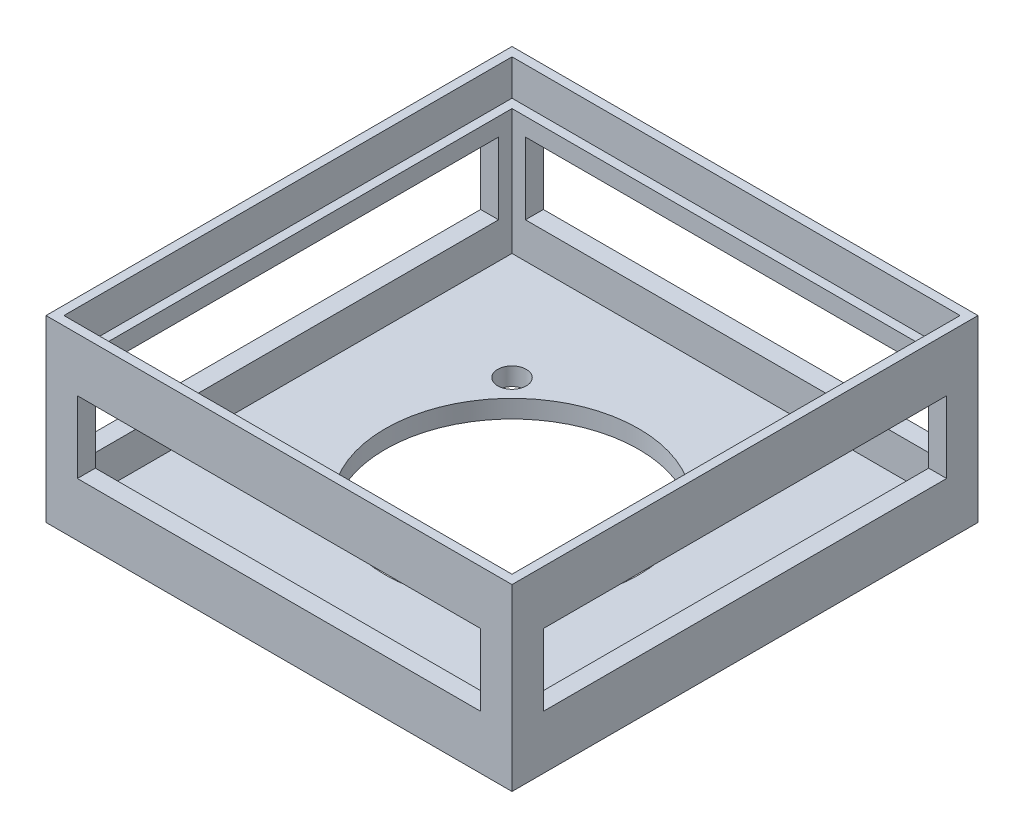
ISO-10303-21;
HEADER;
FILE_DESCRIPTION(('STEP AP214'),'2;1');
FILE_NAME('part.step','',(''),(''),'','','');
FILE_SCHEMA(('AUTOMOTIVE_DESIGN { 1 0 10303 214 1 1 1 1 }'));
ENDSEC;
DATA;
#1=APPLICATION_CONTEXT('core data for automotive mechanical design processes');
#2=APPLICATION_PROTOCOL_DEFINITION('international standard','automotive_design',2000,#1);
#3=PRODUCT_CONTEXT('',#1,'mechanical');
#4=PRODUCT('Part','Part','',(#3));
#5=PRODUCT_RELATED_PRODUCT_CATEGORY('part','',(#4));
#6=PRODUCT_DEFINITION_FORMATION('','',#4);
#7=PRODUCT_DEFINITION_CONTEXT('part definition',#1,'design');
#8=PRODUCT_DEFINITION('design','',#6,#7);
#9=PRODUCT_DEFINITION_SHAPE('','',#8);
#10=(LENGTH_UNIT() NAMED_UNIT(*) SI_UNIT(.MILLI.,.METRE.));
#11=(NAMED_UNIT(*) PLANE_ANGLE_UNIT() SI_UNIT($,.RADIAN.));
#12=(NAMED_UNIT(*) SI_UNIT($,.STERADIAN.) SOLID_ANGLE_UNIT());
#13=UNCERTAINTY_MEASURE_WITH_UNIT(LENGTH_MEASURE(1.E-05),#10,'distance_accuracy_value','');
#14=(GEOMETRIC_REPRESENTATION_CONTEXT(3) GLOBAL_UNCERTAINTY_ASSIGNED_CONTEXT((#13)) GLOBAL_UNIT_ASSIGNED_CONTEXT((#10,
#11,#12)) REPRESENTATION_CONTEXT('',''));
#15=CARTESIAN_POINT('',(0.,0.,0.));
#16=DIRECTION('',(0.,0.,1.));
#17=DIRECTION('',(1.,0.,0.));
#18=AXIS2_PLACEMENT_3D('',#15,#16,#17);
#19=CARTESIAN_POINT('',(0.,20.,0.));
#20=DIRECTION('',(0.,1.,0.));
#21=DIRECTION('',(0.,0.,1.));
#22=AXIS2_PLACEMENT_3D('',#19,#20,#21);
#23=PLANE('',#22);
#24=DIRECTION('',(1.,0.,0.));
#25=VECTOR('',#24,1.);
#26=CARTESIAN_POINT('',(-26.,20.,26.));
#27=LINE('',#26,#25);
#28=CARTESIAN_POINT('',(-26.,20.,26.));
#29=VERTEX_POINT('',#28);
#30=CARTESIAN_POINT('',(26.,20.,26.));
#31=VERTEX_POINT('',#30);
#32=EDGE_CURVE('E599',#29,#31,#27,.T.);
#33=ORIENTED_EDGE('',*,*,#32,.T.);
#34=DIRECTION('',(0.,0.,-1.));
#35=VECTOR('',#34,1.);
#36=CARTESIAN_POINT('',(26.,20.,26.));
#37=LINE('',#36,#35);
#38=CARTESIAN_POINT('',(26.,20.,-26.));
#39=VERTEX_POINT('',#38);
#40=EDGE_CURVE('E603',#31,#39,#37,.T.);
#41=ORIENTED_EDGE('',*,*,#40,.T.);
#42=DIRECTION('',(1.,0.,0.));
#43=VECTOR('',#42,1.);
#44=CARTESIAN_POINT('',(-26.,20.,-26.));
#45=LINE('',#44,#43);
#46=CARTESIAN_POINT('',(-26.,20.,-26.));
#47=VERTEX_POINT('',#46);
#48=EDGE_CURVE('E607',#47,#39,#45,.T.);
#49=ORIENTED_EDGE('',*,*,#48,.F.);
#50=DIRECTION('',(0.,0.,-1.));
#51=VECTOR('',#50,1.);
#52=CARTESIAN_POINT('',(-26.,20.,26.));
#53=LINE('',#52,#51);
#54=EDGE_CURVE('E611',#29,#47,#53,.T.);
#55=ORIENTED_EDGE('',*,*,#54,.F.);
#56=EDGE_LOOP('',(#33,#41,#49,#55));
#57=FACE_BOUND('',#56,.T.);
#58=DIRECTION('',(0.,0.,1.));
#59=VECTOR('',#58,1.);
#60=CARTESIAN_POINT('',(-25.,20.,0.));
#61=LINE('',#60,#59);
#62=CARTESIAN_POINT('',(-25.,20.,-25.));
#63=VERTEX_POINT('',#62);
#64=CARTESIAN_POINT('',(-25.,20.,25.));
#65=VERTEX_POINT('',#64);
#66=EDGE_CURVE('E514',#63,#65,#61,.T.);
#67=ORIENTED_EDGE('',*,*,#66,.F.);
#68=DIRECTION('',(1.,0.,0.));
#69=VECTOR('',#68,1.);
#70=CARTESIAN_POINT('',(0.,20.,-25.));
#71=LINE('',#70,#69);
#72=CARTESIAN_POINT('',(25.,20.,-25.));
#73=VERTEX_POINT('',#72);
#74=EDGE_CURVE('E481',#63,#73,#71,.T.);
#75=ORIENTED_EDGE('',*,*,#74,.T.);
#76=DIRECTION('',(0.,0.,1.));
#77=VECTOR('',#76,1.);
#78=CARTESIAN_POINT('',(25.,20.,0.));
#79=LINE('',#78,#77);
#80=CARTESIAN_POINT('',(25.,20.,25.));
#81=VERTEX_POINT('',#80);
#82=EDGE_CURVE('E487',#73,#81,#79,.T.);
#83=ORIENTED_EDGE('',*,*,#82,.T.);
#84=DIRECTION('',(1.,0.,0.));
#85=VECTOR('',#84,1.);
#86=CARTESIAN_POINT('',(0.,20.,25.));
#87=LINE('',#86,#85);
#88=EDGE_CURVE('E518',#65,#81,#87,.T.);
#89=ORIENTED_EDGE('',*,*,#88,.F.);
#90=EDGE_LOOP('',(#67,#75,#83,#89));
#91=FACE_BOUND('',#90,.T.);
#92=ADVANCED_FACE('F128',(#57,#91),#23,.T.);
#93=CARTESIAN_POINT('',(-26.,20.,24.));
#94=DIRECTION('',(0.,0.,-1.));
#95=DIRECTION('',(-1.,0.,0.));
#96=AXIS2_PLACEMENT_3D('',#93,#94,#95);
#97=PLANE('',#96);
#98=DIRECTION('',(0.,1.,0.));
#99=VECTOR('',#98,1.);
#100=CARTESIAN_POINT('',(-22.5,20.,24.));
#101=LINE('',#100,#99);
#102=CARTESIAN_POINT('',(-22.5,6.,24.));
#103=VERTEX_POINT('',#102);
#104=CARTESIAN_POINT('',(-22.5,14.,24.));
#105=VERTEX_POINT('',#104);
#106=EDGE_CURVE('E478',#103,#105,#101,.T.);
#107=ORIENTED_EDGE('',*,*,#106,.F.);
#108=DIRECTION('',(-1.,0.,0.));
#109=VECTOR('',#108,1.);
#110=CARTESIAN_POINT('',(-26.,6.,24.));
#111=LINE('',#110,#109);
#112=CARTESIAN_POINT('',(22.5,6.,24.));
#113=VERTEX_POINT('',#112);
#114=EDGE_CURVE('E456',#113,#103,#111,.T.);
#115=ORIENTED_EDGE('',*,*,#114,.F.);
#116=DIRECTION('',(0.,-1.,0.));
#117=VECTOR('',#116,1.);
#118=CARTESIAN_POINT('',(22.5,20.,24.));
#119=LINE('',#118,#117);
#120=CARTESIAN_POINT('',(22.5,14.,24.));
#121=VERTEX_POINT('',#120);
#122=EDGE_CURVE('E463',#121,#113,#119,.T.);
#123=ORIENTED_EDGE('',*,*,#122,.F.);
#124=DIRECTION('',(1.,0.,0.));
#125=VECTOR('',#124,1.);
#126=CARTESIAN_POINT('',(-26.,14.,24.));
#127=LINE('',#126,#125);
#128=EDGE_CURVE('E471',#105,#121,#127,.T.);
#129=ORIENTED_EDGE('',*,*,#128,.F.);
#130=EDGE_LOOP('',(#107,#115,#123,#129));
#131=FACE_BOUND('',#130,.T.);
#132=DIRECTION('',(0.,-1.,0.));
#133=VECTOR('',#132,1.);
#134=CARTESIAN_POINT('',(-24.,20.,24.));
#135=LINE('',#134,#133);
#136=CARTESIAN_POINT('',(-24.,16.,24.));
#137=VERTEX_POINT('',#136);
#138=CARTESIAN_POINT('',(-24.,2.,24.));
#139=VERTEX_POINT('',#138);
#140=EDGE_CURVE('E549',#137,#139,#135,.T.);
#141=ORIENTED_EDGE('',*,*,#140,.F.);
#142=DIRECTION('',(-1.,0.,0.));
#143=VECTOR('',#142,1.);
#144=CARTESIAN_POINT('',(0.,16.,24.));
#145=LINE('',#144,#143);
#146=CARTESIAN_POINT('',(24.,16.,24.));
#147=VERTEX_POINT('',#146);
#148=EDGE_CURVE('E501',#147,#137,#145,.T.);
#149=ORIENTED_EDGE('',*,*,#148,.F.);
#150=DIRECTION('',(0.,-1.,0.));
#151=VECTOR('',#150,1.);
#152=CARTESIAN_POINT('',(24.,20.,24.));
#153=LINE('',#152,#151);
#154=CARTESIAN_POINT('',(24.,2.,24.));
#155=VERTEX_POINT('',#154);
#156=EDGE_CURVE('E557',#147,#155,#153,.T.);
#157=ORIENTED_EDGE('',*,*,#156,.T.);
#158=DIRECTION('',(1.,0.,0.));
#159=VECTOR('',#158,1.);
#160=CARTESIAN_POINT('',(-26.,2.,24.));
#161=LINE('',#160,#159);
#162=EDGE_CURVE('E539',#139,#155,#161,.T.);
#163=ORIENTED_EDGE('',*,*,#162,.F.);
#164=EDGE_LOOP('',(#141,#149,#157,#163));
#165=FACE_BOUND('',#164,.T.);
#166=ADVANCED_FACE('F658',(#131,#165),#97,.T.);
#167=CARTESIAN_POINT('',(24.,20.,26.));
#168=DIRECTION('',(-1.,0.,0.));
#169=DIRECTION('',(0.,0.,1.));
#170=AXIS2_PLACEMENT_3D('',#167,#168,#169);
#171=PLANE('',#170);
#172=DIRECTION('',(0.,1.,0.));
#173=VECTOR('',#172,1.);
#174=CARTESIAN_POINT('',(24.,20.,22.5));
#175=LINE('',#174,#173);
#176=CARTESIAN_POINT('',(24.,6.,22.5));
#177=VERTEX_POINT('',#176);
#178=CARTESIAN_POINT('',(24.,14.,22.5));
#179=VERTEX_POINT('',#178);
#180=EDGE_CURVE('E399',#177,#179,#175,.T.);
#181=ORIENTED_EDGE('',*,*,#180,.F.);
#182=DIRECTION('',(0.,0.,1.));
#183=VECTOR('',#182,1.);
#184=CARTESIAN_POINT('',(24.,6.,26.));
#185=LINE('',#184,#183);
#186=CARTESIAN_POINT('',(24.,6.,-22.5));
#187=VERTEX_POINT('',#186);
#188=EDGE_CURVE('E379',#187,#177,#185,.T.);
#189=ORIENTED_EDGE('',*,*,#188,.F.);
#190=DIRECTION('',(0.,-1.,0.));
#191=VECTOR('',#190,1.);
#192=CARTESIAN_POINT('',(24.,20.,-22.5));
#193=LINE('',#192,#191);
#194=CARTESIAN_POINT('',(24.,14.,-22.5));
#195=VERTEX_POINT('',#194);
#196=EDGE_CURVE('E319',#195,#187,#193,.T.);
#197=ORIENTED_EDGE('',*,*,#196,.F.);
#198=DIRECTION('',(0.,0.,-1.));
#199=VECTOR('',#198,1.);
#200=CARTESIAN_POINT('',(24.,14.,26.));
#201=LINE('',#200,#199);
#202=EDGE_CURVE('E392',#179,#195,#201,.T.);
#203=ORIENTED_EDGE('',*,*,#202,.F.);
#204=EDGE_LOOP('',(#181,#189,#197,#203));
#205=FACE_BOUND('',#204,.T.);
#206=ORIENTED_EDGE('',*,*,#156,.F.);
#207=DIRECTION('',(0.,0.,1.));
#208=VECTOR('',#207,1.);
#209=CARTESIAN_POINT('',(24.,16.,0.));
#210=LINE('',#209,#208);
#211=CARTESIAN_POINT('',(24.,16.,-24.));
#212=VERTEX_POINT('',#211);
#213=EDGE_CURVE('E498',#212,#147,#210,.T.);
#214=ORIENTED_EDGE('',*,*,#213,.F.);
#215=DIRECTION('',(0.,-1.,0.));
#216=VECTOR('',#215,1.);
#217=CARTESIAN_POINT('',(24.,20.,-24.));
#218=LINE('',#217,#216);
#219=CARTESIAN_POINT('',(24.,2.,-24.));
#220=VERTEX_POINT('',#219);
#221=EDGE_CURVE('E561',#212,#220,#218,.T.);
#222=ORIENTED_EDGE('',*,*,#221,.T.);
#223=DIRECTION('',(0.,0.,-1.));
#224=VECTOR('',#223,1.);
#225=CARTESIAN_POINT('',(24.,2.,26.));
#226=LINE('',#225,#224);
#227=EDGE_CURVE('E543',#155,#220,#226,.T.);
#228=ORIENTED_EDGE('',*,*,#227,.F.);
#229=EDGE_LOOP('',(#206,#214,#222,#228));
#230=FACE_BOUND('',#229,.T.);
#231=ADVANCED_FACE('F696',(#205,#230),#171,.T.);
#232=CARTESIAN_POINT('',(-26.,20.,-24.));
#233=DIRECTION('',(0.,0.,-1.));
#234=DIRECTION('',(-1.,0.,0.));
#235=AXIS2_PLACEMENT_3D('',#232,#233,#234);
#236=PLANE('',#235);
#237=DIRECTION('',(-1.,0.,0.));
#238=VECTOR('',#237,1.);
#239=CARTESIAN_POINT('',(-26.,6.,-24.));
#240=LINE('',#239,#238);
#241=CARTESIAN_POINT('',(22.5,6.,-24.));
#242=VERTEX_POINT('',#241);
#243=CARTESIAN_POINT('',(-22.5,6.,-24.));
#244=VERTEX_POINT('',#243);
#245=EDGE_CURVE('E438',#242,#244,#240,.T.);
#246=ORIENTED_EDGE('',*,*,#245,.T.);
#247=DIRECTION('',(0.,1.,0.));
#248=VECTOR('',#247,1.);
#249=CARTESIAN_POINT('',(-22.5,20.,-24.));
#250=LINE('',#249,#248);
#251=CARTESIAN_POINT('',(-22.5,14.,-24.));
#252=VERTEX_POINT('',#251);
#253=EDGE_CURVE('E474',#244,#252,#250,.T.);
#254=ORIENTED_EDGE('',*,*,#253,.T.);
#255=DIRECTION('',(1.,0.,0.));
#256=VECTOR('',#255,1.);
#257=CARTESIAN_POINT('',(-26.,14.,-24.));
#258=LINE('',#257,#256);
#259=CARTESIAN_POINT('',(22.5,14.,-24.));
#260=VERTEX_POINT('',#259);
#261=EDGE_CURVE('E467',#252,#260,#258,.T.);
#262=ORIENTED_EDGE('',*,*,#261,.T.);
#263=DIRECTION('',(0.,-1.,0.));
#264=VECTOR('',#263,1.);
#265=CARTESIAN_POINT('',(22.5,20.,-24.));
#266=LINE('',#265,#264);
#267=EDGE_CURVE('E459',#260,#242,#266,.T.);
#268=ORIENTED_EDGE('',*,*,#267,.T.);
#269=EDGE_LOOP('',(#246,#254,#262,#268));
#270=FACE_BOUND('',#269,.T.);
#271=DIRECTION('',(1.,0.,0.));
#272=VECTOR('',#271,1.);
#273=CARTESIAN_POINT('',(0.,16.,-24.));
#274=LINE('',#273,#272);
#275=CARTESIAN_POINT('',(-24.,16.,-24.));
#276=VERTEX_POINT('',#275);
#277=EDGE_CURVE('E507',#276,#212,#274,.T.);
#278=ORIENTED_EDGE('',*,*,#277,.F.);
#279=DIRECTION('',(0.,-1.,0.));
#280=VECTOR('',#279,1.);
#281=CARTESIAN_POINT('',(-24.,20.,-24.));
#282=LINE('',#281,#280);
#283=CARTESIAN_POINT('',(-24.,2.,-24.));
#284=VERTEX_POINT('',#283);
#285=EDGE_CURVE('E564',#276,#284,#282,.T.);
#286=ORIENTED_EDGE('',*,*,#285,.T.);
#287=DIRECTION('',(1.,0.,0.));
#288=VECTOR('',#287,1.);
#289=CARTESIAN_POINT('',(-26.,2.,-24.));
#290=LINE('',#289,#288);
#291=EDGE_CURVE('E550',#284,#220,#290,.T.);
#292=ORIENTED_EDGE('',*,*,#291,.T.);
#293=ORIENTED_EDGE('',*,*,#221,.F.);
#294=EDGE_LOOP('',(#278,#286,#292,#293));
#295=FACE_BOUND('',#294,.T.);
#296=ADVANCED_FACE('F700',(#270,#295),#236,.F.);
#297=CARTESIAN_POINT('',(-24.,20.,26.));
#298=DIRECTION('',(-1.,0.,0.));
#299=DIRECTION('',(0.,0.,1.));
#300=AXIS2_PLACEMENT_3D('',#297,#298,#299);
#301=PLANE('',#300);
#302=DIRECTION('',(0.,0.,1.));
#303=VECTOR('',#302,1.);
#304=CARTESIAN_POINT('',(-24.,6.,26.));
#305=LINE('',#304,#303);
#306=CARTESIAN_POINT('',(-24.,6.,-22.5));
#307=VERTEX_POINT('',#306);
#308=CARTESIAN_POINT('',(-24.,6.,22.5));
#309=VERTEX_POINT('',#308);
#310=EDGE_CURVE('E365',#307,#309,#305,.T.);
#311=ORIENTED_EDGE('',*,*,#310,.T.);
#312=DIRECTION('',(0.,1.,0.));
#313=VECTOR('',#312,1.);
#314=CARTESIAN_POINT('',(-24.,20.,22.5));
#315=LINE('',#314,#313);
#316=CARTESIAN_POINT('',(-24.,14.,22.5));
#317=VERTEX_POINT('',#316);
#318=EDGE_CURVE('E395',#309,#317,#315,.T.);
#319=ORIENTED_EDGE('',*,*,#318,.T.);
#320=DIRECTION('',(0.,0.,-1.));
#321=VECTOR('',#320,1.);
#322=CARTESIAN_POINT('',(-24.,14.,26.));
#323=LINE('',#322,#321);
#324=CARTESIAN_POINT('',(-24.,14.,-22.5));
#325=VERTEX_POINT('',#324);
#326=EDGE_CURVE('E388',#317,#325,#323,.T.);
#327=ORIENTED_EDGE('',*,*,#326,.T.);
#328=DIRECTION('',(0.,-1.,0.));
#329=VECTOR('',#328,1.);
#330=CARTESIAN_POINT('',(-24.,20.,-22.5));
#331=LINE('',#330,#329);
#332=EDGE_CURVE('E382',#325,#307,#331,.T.);
#333=ORIENTED_EDGE('',*,*,#332,.T.);
#334=EDGE_LOOP('',(#311,#319,#327,#333));
#335=FACE_BOUND('',#334,.T.);
#336=DIRECTION('',(0.,0.,-1.));
#337=VECTOR('',#336,1.);
#338=CARTESIAN_POINT('',(-24.,16.,0.));
#339=LINE('',#338,#337);
#340=EDGE_CURVE('E504',#137,#276,#339,.T.);
#341=ORIENTED_EDGE('',*,*,#340,.F.);
#342=ORIENTED_EDGE('',*,*,#140,.T.);
#343=DIRECTION('',(0.,0.,-1.));
#344=VECTOR('',#343,1.);
#345=CARTESIAN_POINT('',(-24.,2.,26.));
#346=LINE('',#345,#344);
#347=EDGE_CURVE('E545',#139,#284,#346,.T.);
#348=ORIENTED_EDGE('',*,*,#347,.T.);
#349=ORIENTED_EDGE('',*,*,#285,.F.);
#350=EDGE_LOOP('',(#341,#342,#348,#349));
#351=FACE_BOUND('',#350,.T.);
#352=ADVANCED_FACE('F704',(#335,#351),#301,.F.);
#353=CARTESIAN_POINT('',(-12.,20.,12.));
#354=DIRECTION('',(0.,-1.,0.));
#355=DIRECTION('',(0.,0.,-1.));
#356=AXIS2_PLACEMENT_3D('',#353,#354,#355);
#357=CYLINDRICAL_SURFACE('',#356,1.6);
#358=CARTESIAN_POINT('',(-12.,0.,12.));
#359=DIRECTION('',(0.,1.,0.));
#360=DIRECTION('',(0.,0.,1.));
#361=AXIS2_PLACEMENT_3D('',#358,#359,#360);
#362=CIRCLE('',#361,1.6);
#363=CARTESIAN_POINT('',(-12.,0.,13.6));
#364=VERTEX_POINT('',#363);
#365=EDGE_CURVE('E594',#364,#364,#362,.F.);
#366=ORIENTED_EDGE('',*,*,#365,.T.);
#367=EDGE_LOOP('',(#366));
#368=FACE_BOUND('',#367,.T.);
#369=CARTESIAN_POINT('',(-12.,2.,12.));
#370=DIRECTION('',(0.,1.,0.));
#371=DIRECTION('',(0.,0.,1.));
#372=AXIS2_PLACEMENT_3D('',#369,#370,#371);
#373=CIRCLE('',#372,1.6);
#374=CARTESIAN_POINT('',(-12.,2.,13.6));
#375=VERTEX_POINT('',#374);
#376=EDGE_CURVE('E544',#375,#375,#373,.F.);
#377=ORIENTED_EDGE('',*,*,#376,.F.);
#378=EDGE_LOOP('',(#377));
#379=FACE_BOUND('',#378,.T.);
#380=ADVANCED_FACE('F708',(#368,#379),#357,.F.);
#381=CARTESIAN_POINT('',(12.,20.,-12.));
#382=DIRECTION('',(0.,-1.,0.));
#383=DIRECTION('',(0.,0.,-1.));
#384=AXIS2_PLACEMENT_3D('',#381,#382,#383);
#385=CYLINDRICAL_SURFACE('',#384,1.6);
#386=CARTESIAN_POINT('',(12.,0.,-12.));
#387=DIRECTION('',(0.,1.,0.));
#388=DIRECTION('',(0.,0.,1.));
#389=AXIS2_PLACEMENT_3D('',#386,#387,#388);
#390=CIRCLE('',#389,1.6);
#391=CARTESIAN_POINT('',(12.,0.,-10.4));
#392=VERTEX_POINT('',#391);
#393=EDGE_CURVE('E590',#392,#392,#390,.F.);
#394=ORIENTED_EDGE('',*,*,#393,.T.);
#395=EDGE_LOOP('',(#394));
#396=FACE_BOUND('',#395,.T.);
#397=CARTESIAN_POINT('',(12.,2.,-12.));
#398=DIRECTION('',(0.,1.,0.));
#399=DIRECTION('',(0.,0.,1.));
#400=AXIS2_PLACEMENT_3D('',#397,#398,#399);
#401=CIRCLE('',#400,1.6);
#402=CARTESIAN_POINT('',(12.,2.,-10.4));
#403=VERTEX_POINT('',#402);
#404=EDGE_CURVE('E569',#403,#403,#401,.F.);
#405=ORIENTED_EDGE('',*,*,#404,.F.);
#406=EDGE_LOOP('',(#405));
#407=FACE_BOUND('',#406,.T.);
#408=ADVANCED_FACE('F717',(#396,#407),#385,.F.);
#409=CARTESIAN_POINT('',(-12.,20.,-12.));
#410=DIRECTION('',(0.,-1.,0.));
#411=DIRECTION('',(0.,0.,-1.));
#412=AXIS2_PLACEMENT_3D('',#409,#410,#411);
#413=CYLINDRICAL_SURFACE('',#412,1.6);
#414=CARTESIAN_POINT('',(-12.,0.,-12.));
#415=DIRECTION('',(0.,1.,0.));
#416=DIRECTION('',(0.,0.,1.));
#417=AXIS2_PLACEMENT_3D('',#414,#415,#416);
#418=CIRCLE('',#417,1.6);
#419=CARTESIAN_POINT('',(-12.,0.,-10.4));
#420=VERTEX_POINT('',#419);
#421=EDGE_CURVE('E586',#420,#420,#418,.T.);
#422=ORIENTED_EDGE('',*,*,#421,.F.);
#423=EDGE_LOOP('',(#422));
#424=FACE_BOUND('',#423,.T.);
#425=CARTESIAN_POINT('',(-12.,2.,-12.));
#426=DIRECTION('',(0.,1.,0.));
#427=DIRECTION('',(0.,0.,1.));
#428=AXIS2_PLACEMENT_3D('',#425,#426,#427);
#429=CIRCLE('',#428,1.6);
#430=CARTESIAN_POINT('',(-12.,2.,-10.4));
#431=VERTEX_POINT('',#430);
#432=EDGE_CURVE('E573',#431,#431,#429,.T.);
#433=ORIENTED_EDGE('',*,*,#432,.T.);
#434=EDGE_LOOP('',(#433));
#435=FACE_BOUND('',#434,.T.);
#436=ADVANCED_FACE('F713',(#424,#435),#413,.F.);
#437=CARTESIAN_POINT('',(12.,20.,12.));
#438=DIRECTION('',(0.,-1.,0.));
#439=DIRECTION('',(0.,0.,-1.));
#440=AXIS2_PLACEMENT_3D('',#437,#438,#439);
#441=CYLINDRICAL_SURFACE('',#440,1.6);
#442=CARTESIAN_POINT('',(12.,0.,12.));
#443=DIRECTION('',(0.,1.,0.));
#444=DIRECTION('',(0.,0.,1.));
#445=AXIS2_PLACEMENT_3D('',#442,#443,#444);
#446=CIRCLE('',#445,1.6);
#447=CARTESIAN_POINT('',(12.,0.,13.6));
#448=VERTEX_POINT('',#447);
#449=EDGE_CURVE('E560',#448,#448,#446,.T.);
#450=ORIENTED_EDGE('',*,*,#449,.F.);
#451=EDGE_LOOP('',(#450));
#452=FACE_BOUND('',#451,.T.);
#453=CARTESIAN_POINT('',(12.,2.,12.));
#454=DIRECTION('',(0.,1.,0.));
#455=DIRECTION('',(0.,0.,1.));
#456=AXIS2_PLACEMENT_3D('',#453,#454,#455);
#457=CIRCLE('',#456,1.6);
#458=CARTESIAN_POINT('',(12.,2.,13.6));
#459=VERTEX_POINT('',#458);
#460=EDGE_CURVE('E529',#459,#459,#457,.T.);
#461=ORIENTED_EDGE('',*,*,#460,.T.);
#462=EDGE_LOOP('',(#461));
#463=FACE_BOUND('',#462,.T.);
#464=ADVANCED_FACE('F710',(#452,#463),#441,.F.);
#465=CARTESIAN_POINT('',(0.,0.,0.));
#466=DIRECTION('',(0.,1.,0.));
#467=DIRECTION('',(0.,0.,1.));
#468=AXIS2_PLACEMENT_3D('',#465,#466,#467);
#469=PLANE('',#468);
#470=ORIENTED_EDGE('',*,*,#393,.F.);
#471=EDGE_LOOP('',(#470));
#472=FACE_BOUND('',#471,.T.);
#473=CARTESIAN_POINT('',(0.,0.,0.));
#474=DIRECTION('',(0.,-1.,0.));
#475=DIRECTION('',(0.,0.,-1.));
#476=AXIS2_PLACEMENT_3D('',#473,#474,#475);
#477=CIRCLE('',#476,14.142135623731);
#478=CARTESIAN_POINT('',(0.,0.,-14.142135623731));
#479=VERTEX_POINT('',#478);
#480=EDGE_CURVE('E765',#479,#479,#477,.T.);
#481=ORIENTED_EDGE('',*,*,#480,.F.);
#482=EDGE_LOOP('',(#481));
#483=FACE_BOUND('',#482,.T.);
#484=ORIENTED_EDGE('',*,*,#365,.F.);
#485=EDGE_LOOP('',(#484));
#486=FACE_BOUND('',#485,.T.);
#487=DIRECTION('',(1.,0.,0.));
#488=VECTOR('',#487,1.);
#489=CARTESIAN_POINT('',(-26.,0.,26.));
#490=LINE('',#489,#488);
#491=CARTESIAN_POINT('',(-26.,0.,26.));
#492=VERTEX_POINT('',#491);
#493=CARTESIAN_POINT('',(26.,0.,26.));
#494=VERTEX_POINT('',#493);
#495=EDGE_CURVE('E598',#492,#494,#490,.T.);
#496=ORIENTED_EDGE('',*,*,#495,.F.);
#497=DIRECTION('',(0.,0.,-1.));
#498=VECTOR('',#497,1.);
#499=CARTESIAN_POINT('',(-26.,0.,26.));
#500=LINE('',#499,#498);
#501=CARTESIAN_POINT('',(-26.,0.,-26.));
#502=VERTEX_POINT('',#501);
#503=EDGE_CURVE('E604',#492,#502,#500,.T.);
#504=ORIENTED_EDGE('',*,*,#503,.T.);
#505=DIRECTION('',(1.,0.,0.));
#506=VECTOR('',#505,1.);
#507=CARTESIAN_POINT('',(-26.,0.,-26.));
#508=LINE('',#507,#506);
#509=CARTESIAN_POINT('',(26.,0.,-26.));
#510=VERTEX_POINT('',#509);
#511=EDGE_CURVE('E623',#502,#510,#508,.T.);
#512=ORIENTED_EDGE('',*,*,#511,.T.);
#513=DIRECTION('',(0.,0.,-1.));
#514=VECTOR('',#513,1.);
#515=CARTESIAN_POINT('',(26.,0.,26.));
#516=LINE('',#515,#514);
#517=EDGE_CURVE('E619',#494,#510,#516,.T.);
#518=ORIENTED_EDGE('',*,*,#517,.F.);
#519=EDGE_LOOP('',(#496,#504,#512,#518));
#520=FACE_BOUND('',#519,.T.);
#521=ORIENTED_EDGE('',*,*,#421,.T.);
#522=EDGE_LOOP('',(#521));
#523=FACE_BOUND('',#522,.T.);
#524=ORIENTED_EDGE('',*,*,#449,.T.);
#525=EDGE_LOOP('',(#524));
#526=FACE_BOUND('',#525,.T.);
#527=ADVANCED_FACE('F646',(#472,#483,#486,#520,#523,#526),#469,.F.);
#528=CARTESIAN_POINT('',(-26.,20.,26.));
#529=DIRECTION('',(0.,0.,-1.));
#530=DIRECTION('',(-1.,0.,0.));
#531=AXIS2_PLACEMENT_3D('',#528,#529,#530);
#532=PLANE('',#531);
#533=DIRECTION('',(1.,0.,0.));
#534=VECTOR('',#533,1.);
#535=CARTESIAN_POINT('',(22.5,6.,26.));
#536=LINE('',#535,#534);
#537=CARTESIAN_POINT('',(-22.5,6.,26.));
#538=VERTEX_POINT('',#537);
#539=CARTESIAN_POINT('',(22.5,6.,26.));
#540=VERTEX_POINT('',#539);
#541=EDGE_CURVE('E405',#538,#540,#536,.T.);
#542=ORIENTED_EDGE('',*,*,#541,.F.);
#543=DIRECTION('',(0.,-1.,0.));
#544=VECTOR('',#543,1.);
#545=CARTESIAN_POINT('',(-22.5,14.,26.));
#546=LINE('',#545,#544);
#547=CARTESIAN_POINT('',(-22.5,14.,26.));
#548=VERTEX_POINT('',#547);
#549=EDGE_CURVE('E402',#548,#538,#546,.T.);
#550=ORIENTED_EDGE('',*,*,#549,.F.);
#551=DIRECTION('',(-1.,0.,0.));
#552=VECTOR('',#551,1.);
#553=CARTESIAN_POINT('',(22.5,14.,26.));
#554=LINE('',#553,#552);
#555=CARTESIAN_POINT('',(22.5,14.,26.));
#556=VERTEX_POINT('',#555);
#557=EDGE_CURVE('E413',#556,#548,#554,.T.);
#558=ORIENTED_EDGE('',*,*,#557,.F.);
#559=DIRECTION('',(0.,1.,0.));
#560=VECTOR('',#559,1.);
#561=CARTESIAN_POINT('',(22.5,14.,26.));
#562=LINE('',#561,#560);
#563=EDGE_CURVE('E409',#540,#556,#562,.T.);
#564=ORIENTED_EDGE('',*,*,#563,.F.);
#565=EDGE_LOOP('',(#542,#550,#558,#564));
#566=FACE_BOUND('',#565,.T.);
#567=ORIENTED_EDGE('',*,*,#495,.T.);
#568=DIRECTION('',(0.,-1.,0.));
#569=VECTOR('',#568,1.);
#570=CARTESIAN_POINT('',(26.,20.,26.));
#571=LINE('',#570,#569);
#572=EDGE_CURVE('E137',#31,#494,#571,.T.);
#573=ORIENTED_EDGE('',*,*,#572,.F.);
#574=ORIENTED_EDGE('',*,*,#32,.F.);
#575=DIRECTION('',(0.,-1.,0.));
#576=VECTOR('',#575,1.);
#577=CARTESIAN_POINT('',(-26.,20.,26.));
#578=LINE('',#577,#576);
#579=EDGE_CURVE('E615',#29,#492,#578,.T.);
#580=ORIENTED_EDGE('',*,*,#579,.T.);
#581=EDGE_LOOP('',(#567,#573,#574,#580));
#582=FACE_BOUND('',#581,.T.);
#583=ADVANCED_FACE('F130',(#566,#582),#532,.F.);
#584=CARTESIAN_POINT('',(26.,20.,26.));
#585=DIRECTION('',(-1.,0.,0.));
#586=DIRECTION('',(0.,0.,1.));
#587=AXIS2_PLACEMENT_3D('',#584,#585,#586);
#588=PLANE('',#587);
#589=DIRECTION('',(0.,0.,-1.));
#590=VECTOR('',#589,1.);
#591=CARTESIAN_POINT('',(26.,6.,-22.5));
#592=LINE('',#591,#590);
#593=CARTESIAN_POINT('',(26.,6.,22.5));
#594=VERTEX_POINT('',#593);
#595=CARTESIAN_POINT('',(26.,6.,-22.5));
#596=VERTEX_POINT('',#595);
#597=EDGE_CURVE('E326',#594,#596,#592,.T.);
#598=ORIENTED_EDGE('',*,*,#597,.F.);
#599=DIRECTION('',(0.,-1.,0.));
#600=VECTOR('',#599,1.);
#601=CARTESIAN_POINT('',(26.,6.,22.5));
#602=LINE('',#601,#600);
#603=CARTESIAN_POINT('',(26.,14.,22.5));
#604=VERTEX_POINT('',#603);
#605=EDGE_CURVE('E333',#604,#594,#602,.T.);
#606=ORIENTED_EDGE('',*,*,#605,.F.);
#607=DIRECTION('',(0.,0.,1.));
#608=VECTOR('',#607,1.);
#609=CARTESIAN_POINT('',(26.,14.,-22.5));
#610=LINE('',#609,#608);
#611=CARTESIAN_POINT('',(26.,14.,-22.5));
#612=VERTEX_POINT('',#611);
#613=EDGE_CURVE('E338',#612,#604,#610,.T.);
#614=ORIENTED_EDGE('',*,*,#613,.F.);
#615=DIRECTION('',(0.,1.,0.));
#616=VECTOR('',#615,1.);
#617=CARTESIAN_POINT('',(26.,6.,-22.5));
#618=LINE('',#617,#616);
#619=EDGE_CURVE('E316',#596,#612,#618,.T.);
#620=ORIENTED_EDGE('',*,*,#619,.F.);
#621=EDGE_LOOP('',(#598,#606,#614,#620));
#622=FACE_BOUND('',#621,.T.);
#623=ORIENTED_EDGE('',*,*,#517,.T.);
#624=DIRECTION('',(0.,-1.,0.));
#625=VECTOR('',#624,1.);
#626=CARTESIAN_POINT('',(26.,20.,-26.));
#627=LINE('',#626,#625);
#628=EDGE_CURVE('E635',#39,#510,#627,.T.);
#629=ORIENTED_EDGE('',*,*,#628,.F.);
#630=ORIENTED_EDGE('',*,*,#40,.F.);
#631=ORIENTED_EDGE('',*,*,#572,.T.);
#632=EDGE_LOOP('',(#623,#629,#630,#631));
#633=FACE_BOUND('',#632,.T.);
#634=ADVANCED_FACE('F335',(#622,#633),#588,.F.);
#635=CARTESIAN_POINT('',(-26.,20.,-26.));
#636=DIRECTION('',(0.,0.,-1.));
#637=DIRECTION('',(-1.,0.,0.));
#638=AXIS2_PLACEMENT_3D('',#635,#636,#637);
#639=PLANE('',#638);
#640=DIRECTION('',(0.,-1.,0.));
#641=VECTOR('',#640,1.);
#642=CARTESIAN_POINT('',(-22.5,14.,-26.));
#643=LINE('',#642,#641);
#644=CARTESIAN_POINT('',(-22.5,14.,-26.));
#645=VERTEX_POINT('',#644);
#646=CARTESIAN_POINT('',(-22.5,6.,-26.));
#647=VERTEX_POINT('',#646);
#648=EDGE_CURVE('E417',#645,#647,#643,.T.);
#649=ORIENTED_EDGE('',*,*,#648,.T.);
#650=DIRECTION('',(1.,0.,0.));
#651=VECTOR('',#650,1.);
#652=CARTESIAN_POINT('',(22.5,6.,-26.));
#653=LINE('',#652,#651);
#654=CARTESIAN_POINT('',(22.5,6.,-26.));
#655=VERTEX_POINT('',#654);
#656=EDGE_CURVE('E421',#647,#655,#653,.T.);
#657=ORIENTED_EDGE('',*,*,#656,.T.);
#658=DIRECTION('',(0.,1.,0.));
#659=VECTOR('',#658,1.);
#660=CARTESIAN_POINT('',(22.5,14.,-26.));
#661=LINE('',#660,#659);
#662=CARTESIAN_POINT('',(22.5,14.,-26.));
#663=VERTEX_POINT('',#662);
#664=EDGE_CURVE('E425',#655,#663,#661,.T.);
#665=ORIENTED_EDGE('',*,*,#664,.T.);
#666=DIRECTION('',(-1.,0.,0.));
#667=VECTOR('',#666,1.);
#668=CARTESIAN_POINT('',(22.5,14.,-26.));
#669=LINE('',#668,#667);
#670=EDGE_CURVE('E429',#663,#645,#669,.T.);
#671=ORIENTED_EDGE('',*,*,#670,.T.);
#672=EDGE_LOOP('',(#649,#657,#665,#671));
#673=FACE_BOUND('',#672,.T.);
#674=ORIENTED_EDGE('',*,*,#511,.F.);
#675=DIRECTION('',(0.,-1.,0.));
#676=VECTOR('',#675,1.);
#677=CARTESIAN_POINT('',(-26.,20.,-26.));
#678=LINE('',#677,#676);
#679=EDGE_CURVE('E632',#47,#502,#678,.T.);
#680=ORIENTED_EDGE('',*,*,#679,.F.);
#681=ORIENTED_EDGE('',*,*,#48,.T.);
#682=ORIENTED_EDGE('',*,*,#628,.T.);
#683=EDGE_LOOP('',(#674,#680,#681,#682));
#684=FACE_BOUND('',#683,.T.);
#685=ADVANCED_FACE('F654',(#673,#684),#639,.T.);
#686=CARTESIAN_POINT('',(-26.,20.,26.));
#687=DIRECTION('',(-1.,0.,0.));
#688=DIRECTION('',(0.,0.,1.));
#689=AXIS2_PLACEMENT_3D('',#686,#687,#688);
#690=PLANE('',#689);
#691=DIRECTION('',(0.,-1.,0.));
#692=VECTOR('',#691,1.);
#693=CARTESIAN_POINT('',(-26.,6.,22.5));
#694=LINE('',#693,#692);
#695=CARTESIAN_POINT('',(-26.,14.,22.5));
#696=VERTEX_POINT('',#695);
#697=CARTESIAN_POINT('',(-26.,6.,22.5));
#698=VERTEX_POINT('',#697);
#699=EDGE_CURVE('E342',#696,#698,#694,.T.);
#700=ORIENTED_EDGE('',*,*,#699,.T.);
#701=DIRECTION('',(0.,0.,-1.));
#702=VECTOR('',#701,1.);
#703=CARTESIAN_POINT('',(-26.,6.,-22.5));
#704=LINE('',#703,#702);
#705=CARTESIAN_POINT('',(-26.,6.,-22.5));
#706=VERTEX_POINT('',#705);
#707=EDGE_CURVE('E349',#698,#706,#704,.T.);
#708=ORIENTED_EDGE('',*,*,#707,.T.);
#709=DIRECTION('',(0.,1.,0.));
#710=VECTOR('',#709,1.);
#711=CARTESIAN_POINT('',(-26.,6.,-22.5));
#712=LINE('',#711,#710);
#713=CARTESIAN_POINT('',(-26.,14.,-22.5));
#714=VERTEX_POINT('',#713);
#715=EDGE_CURVE('E353',#706,#714,#712,.T.);
#716=ORIENTED_EDGE('',*,*,#715,.T.);
#717=DIRECTION('',(0.,0.,1.));
#718=VECTOR('',#717,1.);
#719=CARTESIAN_POINT('',(-26.,14.,-22.5));
#720=LINE('',#719,#718);
#721=EDGE_CURVE('E357',#714,#696,#720,.T.);
#722=ORIENTED_EDGE('',*,*,#721,.T.);
#723=EDGE_LOOP('',(#700,#708,#716,#722));
#724=FACE_BOUND('',#723,.T.);
#725=ORIENTED_EDGE('',*,*,#503,.F.);
#726=ORIENTED_EDGE('',*,*,#579,.F.);
#727=ORIENTED_EDGE('',*,*,#54,.T.);
#728=ORIENTED_EDGE('',*,*,#679,.T.);
#729=EDGE_LOOP('',(#725,#726,#727,#728));
#730=FACE_BOUND('',#729,.T.);
#731=ADVANCED_FACE('F649',(#724,#730),#690,.T.);
#732=CARTESIAN_POINT('',(0.,2.,0.));
#733=DIRECTION('',(0.,1.,0.));
#734=DIRECTION('',(0.,0.,1.));
#735=AXIS2_PLACEMENT_3D('',#732,#733,#734);
#736=PLANE('',#735);
#737=CARTESIAN_POINT('',(0.,2.,0.));
#738=DIRECTION('',(0.,1.,0.));
#739=DIRECTION('',(0.,0.,1.));
#740=AXIS2_PLACEMENT_3D('',#737,#738,#739);
#741=CIRCLE('',#740,14.142135623731);
#742=CARTESIAN_POINT('',(0.,2.,14.142135623731));
#743=VERTEX_POINT('',#742);
#744=EDGE_CURVE('E12',#743,#743,#741,.T.);
#745=ORIENTED_EDGE('',*,*,#744,.F.);
#746=EDGE_LOOP('',(#745));
#747=FACE_BOUND('',#746,.T.);
#748=ORIENTED_EDGE('',*,*,#404,.T.);
#749=EDGE_LOOP('',(#748));
#750=FACE_BOUND('',#749,.T.);
#751=ORIENTED_EDGE('',*,*,#376,.T.);
#752=EDGE_LOOP('',(#751));
#753=FACE_BOUND('',#752,.T.);
#754=ORIENTED_EDGE('',*,*,#162,.T.);
#755=ORIENTED_EDGE('',*,*,#227,.T.);
#756=ORIENTED_EDGE('',*,*,#291,.F.);
#757=ORIENTED_EDGE('',*,*,#347,.F.);
#758=EDGE_LOOP('',(#754,#755,#756,#757));
#759=FACE_BOUND('',#758,.T.);
#760=ORIENTED_EDGE('',*,*,#432,.F.);
#761=EDGE_LOOP('',(#760));
#762=FACE_BOUND('',#761,.T.);
#763=ORIENTED_EDGE('',*,*,#460,.F.);
#764=EDGE_LOOP('',(#763));
#765=FACE_BOUND('',#764,.T.);
#766=ADVANCED_FACE('F690',(#747,#750,#753,#759,#762,#765),#736,.T.);
#767=CARTESIAN_POINT('',(0.,16.,-25.));
#768=DIRECTION('',(0.,0.,1.));
#769=DIRECTION('',(1.,0.,0.));
#770=AXIS2_PLACEMENT_3D('',#767,#768,#769);
#771=PLANE('',#770);
#772=ORIENTED_EDGE('',*,*,#74,.F.);
#773=DIRECTION('',(0.,1.,0.));
#774=VECTOR('',#773,1.);
#775=CARTESIAN_POINT('',(-25.,16.,-25.));
#776=LINE('',#775,#774);
#777=CARTESIAN_POINT('',(-25.,16.,-25.));
#778=VERTEX_POINT('',#777);
#779=EDGE_CURVE('E510',#778,#63,#776,.T.);
#780=ORIENTED_EDGE('',*,*,#779,.F.);
#781=DIRECTION('',(1.,0.,0.));
#782=VECTOR('',#781,1.);
#783=CARTESIAN_POINT('',(0.,16.,-25.));
#784=LINE('',#783,#782);
#785=CARTESIAN_POINT('',(25.,16.,-25.));
#786=VERTEX_POINT('',#785);
#787=EDGE_CURVE('E482',#778,#786,#784,.T.);
#788=ORIENTED_EDGE('',*,*,#787,.T.);
#789=DIRECTION('',(0.,1.,0.));
#790=VECTOR('',#789,1.);
#791=CARTESIAN_POINT('',(25.,16.,-25.));
#792=LINE('',#791,#790);
#793=EDGE_CURVE('E525',#786,#73,#792,.T.);
#794=ORIENTED_EDGE('',*,*,#793,.T.);
#795=EDGE_LOOP('',(#772,#780,#788,#794));
#796=FACE_BOUND('',#795,.T.);
#797=ADVANCED_FACE('F668',(#796),#771,.T.);
#798=CARTESIAN_POINT('',(25.,16.,0.));
#799=DIRECTION('',(-1.,0.,0.));
#800=DIRECTION('',(0.,0.,1.));
#801=AXIS2_PLACEMENT_3D('',#798,#799,#800);
#802=PLANE('',#801);
#803=ORIENTED_EDGE('',*,*,#82,.F.);
#804=ORIENTED_EDGE('',*,*,#793,.F.);
#805=DIRECTION('',(0.,0.,1.));
#806=VECTOR('',#805,1.);
#807=CARTESIAN_POINT('',(25.,16.,0.));
#808=LINE('',#807,#806);
#809=CARTESIAN_POINT('',(25.,16.,25.));
#810=VERTEX_POINT('',#809);
#811=EDGE_CURVE('E495',#786,#810,#808,.T.);
#812=ORIENTED_EDGE('',*,*,#811,.T.);
#813=DIRECTION('',(0.,1.,0.));
#814=VECTOR('',#813,1.);
#815=CARTESIAN_POINT('',(25.,16.,25.));
#816=LINE('',#815,#814);
#817=EDGE_CURVE('E530',#810,#81,#816,.T.);
#818=ORIENTED_EDGE('',*,*,#817,.T.);
#819=EDGE_LOOP('',(#803,#804,#812,#818));
#820=FACE_BOUND('',#819,.T.);
#821=ADVANCED_FACE('F675',(#820),#802,.T.);
#822=CARTESIAN_POINT('',(0.,16.,25.));
#823=DIRECTION('',(0.,0.,1.));
#824=DIRECTION('',(1.,0.,0.));
#825=AXIS2_PLACEMENT_3D('',#822,#823,#824);
#826=PLANE('',#825);
#827=ORIENTED_EDGE('',*,*,#88,.T.);
#828=ORIENTED_EDGE('',*,*,#817,.F.);
#829=DIRECTION('',(1.,0.,0.));
#830=VECTOR('',#829,1.);
#831=CARTESIAN_POINT('',(0.,16.,25.));
#832=LINE('',#831,#830);
#833=CARTESIAN_POINT('',(-25.,16.,25.));
#834=VERTEX_POINT('',#833);
#835=EDGE_CURVE('E491',#834,#810,#832,.T.);
#836=ORIENTED_EDGE('',*,*,#835,.F.);
#837=DIRECTION('',(0.,1.,0.));
#838=VECTOR('',#837,1.);
#839=CARTESIAN_POINT('',(-25.,16.,25.));
#840=LINE('',#839,#838);
#841=EDGE_CURVE('E533',#834,#65,#840,.T.);
#842=ORIENTED_EDGE('',*,*,#841,.T.);
#843=EDGE_LOOP('',(#827,#828,#836,#842));
#844=FACE_BOUND('',#843,.T.);
#845=ADVANCED_FACE('F677',(#844),#826,.F.);
#846=CARTESIAN_POINT('',(-25.,16.,0.));
#847=DIRECTION('',(-1.,0.,0.));
#848=DIRECTION('',(0.,0.,1.));
#849=AXIS2_PLACEMENT_3D('',#846,#847,#848);
#850=PLANE('',#849);
#851=ORIENTED_EDGE('',*,*,#66,.T.);
#852=ORIENTED_EDGE('',*,*,#841,.F.);
#853=DIRECTION('',(0.,0.,1.));
#854=VECTOR('',#853,1.);
#855=CARTESIAN_POINT('',(-25.,16.,0.));
#856=LINE('',#855,#854);
#857=EDGE_CURVE('E486',#778,#834,#856,.T.);
#858=ORIENTED_EDGE('',*,*,#857,.F.);
#859=ORIENTED_EDGE('',*,*,#779,.T.);
#860=EDGE_LOOP('',(#851,#852,#858,#859));
#861=FACE_BOUND('',#860,.T.);
#862=ADVANCED_FACE('F663',(#861),#850,.F.);
#863=CARTESIAN_POINT('',(0.,16.,0.));
#864=DIRECTION('',(0.,1.,0.));
#865=DIRECTION('',(0.,0.,1.));
#866=AXIS2_PLACEMENT_3D('',#863,#864,#865);
#867=PLANE('',#866);
#868=ORIENTED_EDGE('',*,*,#787,.F.);
#869=ORIENTED_EDGE('',*,*,#857,.T.);
#870=ORIENTED_EDGE('',*,*,#835,.T.);
#871=ORIENTED_EDGE('',*,*,#811,.F.);
#872=EDGE_LOOP('',(#868,#869,#870,#871));
#873=FACE_BOUND('',#872,.T.);
#874=ORIENTED_EDGE('',*,*,#213,.T.);
#875=ORIENTED_EDGE('',*,*,#148,.T.);
#876=ORIENTED_EDGE('',*,*,#340,.T.);
#877=ORIENTED_EDGE('',*,*,#277,.T.);
#878=EDGE_LOOP('',(#874,#875,#876,#877));
#879=FACE_BOUND('',#878,.T.);
#880=ADVANCED_FACE('F671',(#873,#879),#867,.T.);
#881=CARTESIAN_POINT('',(22.5,6.,-26.));
#882=DIRECTION('',(0.,-1.,0.));
#883=DIRECTION('',(1.,0.,0.));
#884=AXIS2_PLACEMENT_3D('',#881,#882,#883);
#885=PLANE('',#884);
#886=DIRECTION('',(0.,0.,1.));
#887=VECTOR('',#886,1.);
#888=CARTESIAN_POINT('',(22.5,6.,-26.));
#889=LINE('',#888,#887);
#890=EDGE_CURVE('E445',#655,#242,#889,.T.);
#891=ORIENTED_EDGE('',*,*,#890,.F.);
#892=ORIENTED_EDGE('',*,*,#656,.F.);
#893=DIRECTION('',(0.,0.,1.));
#894=VECTOR('',#893,1.);
#895=CARTESIAN_POINT('',(-22.5,6.,-26.));
#896=LINE('',#895,#894);
#897=EDGE_CURVE('E450',#647,#244,#896,.T.);
#898=ORIENTED_EDGE('',*,*,#897,.T.);
#899=ORIENTED_EDGE('',*,*,#245,.F.);
#900=EDGE_LOOP('',(#891,#892,#898,#899));
#901=FACE_BOUND('',#900,.T.);
#902=ADVANCED_FACE('F801',(#901),#885,.F.);
#903=CARTESIAN_POINT('',(22.5,14.,-26.));
#904=DIRECTION('',(1.,0.,0.));
#905=DIRECTION('',(0.,1.,0.));
#906=AXIS2_PLACEMENT_3D('',#903,#904,#905);
#907=PLANE('',#906);
#908=DIRECTION('',(0.,0.,1.));
#909=VECTOR('',#908,1.);
#910=CARTESIAN_POINT('',(22.5,14.,-26.));
#911=LINE('',#910,#909);
#912=EDGE_CURVE('E440',#663,#260,#911,.T.);
#913=ORIENTED_EDGE('',*,*,#912,.F.);
#914=ORIENTED_EDGE('',*,*,#664,.F.);
#915=ORIENTED_EDGE('',*,*,#890,.T.);
#916=ORIENTED_EDGE('',*,*,#267,.F.);
#917=EDGE_LOOP('',(#913,#914,#915,#916));
#918=FACE_BOUND('',#917,.T.);
#919=ADVANCED_FACE('F805',(#918),#907,.F.);
#920=CARTESIAN_POINT('',(22.5,14.,-26.));
#921=DIRECTION('',(0.,1.,0.));
#922=DIRECTION('',(-1.,0.,0.));
#923=AXIS2_PLACEMENT_3D('',#920,#921,#922);
#924=PLANE('',#923);
#925=DIRECTION('',(0.,0.,1.));
#926=VECTOR('',#925,1.);
#927=CARTESIAN_POINT('',(-22.5,14.,-26.));
#928=LINE('',#927,#926);
#929=EDGE_CURVE('E434',#645,#252,#928,.T.);
#930=ORIENTED_EDGE('',*,*,#929,.F.);
#931=ORIENTED_EDGE('',*,*,#670,.F.);
#932=ORIENTED_EDGE('',*,*,#912,.T.);
#933=ORIENTED_EDGE('',*,*,#261,.F.);
#934=EDGE_LOOP('',(#930,#931,#932,#933));
#935=FACE_BOUND('',#934,.T.);
#936=ADVANCED_FACE('F823',(#935),#924,.F.);
#937=CARTESIAN_POINT('',(-22.5,14.,-26.));
#938=DIRECTION('',(-1.,0.,0.));
#939=DIRECTION('',(0.,0.,1.));
#940=AXIS2_PLACEMENT_3D('',#937,#938,#939);
#941=PLANE('',#940);
#942=ORIENTED_EDGE('',*,*,#897,.F.);
#943=ORIENTED_EDGE('',*,*,#648,.F.);
#944=ORIENTED_EDGE('',*,*,#929,.T.);
#945=ORIENTED_EDGE('',*,*,#253,.F.);
#946=EDGE_LOOP('',(#942,#943,#944,#945));
#947=FACE_BOUND('',#946,.T.);
#948=ADVANCED_FACE('F812',(#947),#941,.F.);
#949=ORIENTED_EDGE('',*,*,#106,.T.);
#950=EDGE_CURVE('E439',#105,#548,#928,.T.);
#951=ORIENTED_EDGE('',*,*,#950,.T.);
#952=ORIENTED_EDGE('',*,*,#549,.T.);
#953=EDGE_CURVE('E433',#103,#538,#896,.T.);
#954=ORIENTED_EDGE('',*,*,#953,.F.);
#955=EDGE_LOOP('',(#949,#951,#952,#954));
#956=FACE_BOUND('',#955,.T.);
#957=ADVANCED_FACE('F809',(#956),#941,.F.);
#958=ORIENTED_EDGE('',*,*,#128,.T.);
#959=EDGE_CURVE('E444',#121,#556,#911,.T.);
#960=ORIENTED_EDGE('',*,*,#959,.T.);
#961=ORIENTED_EDGE('',*,*,#557,.T.);
#962=ORIENTED_EDGE('',*,*,#950,.F.);
#963=EDGE_LOOP('',(#958,#960,#961,#962));
#964=FACE_BOUND('',#963,.T.);
#965=ADVANCED_FACE('F811',(#964),#924,.F.);
#966=ORIENTED_EDGE('',*,*,#122,.T.);
#967=EDGE_CURVE('E449',#113,#540,#889,.T.);
#968=ORIENTED_EDGE('',*,*,#967,.T.);
#969=ORIENTED_EDGE('',*,*,#563,.T.);
#970=ORIENTED_EDGE('',*,*,#959,.F.);
#971=EDGE_LOOP('',(#966,#968,#969,#970));
#972=FACE_BOUND('',#971,.T.);
#973=ADVANCED_FACE('F816',(#972),#907,.F.);
#974=ORIENTED_EDGE('',*,*,#114,.T.);
#975=ORIENTED_EDGE('',*,*,#953,.T.);
#976=ORIENTED_EDGE('',*,*,#541,.T.);
#977=ORIENTED_EDGE('',*,*,#967,.F.);
#978=EDGE_LOOP('',(#974,#975,#976,#977));
#979=FACE_BOUND('',#978,.T.);
#980=ADVANCED_FACE('F746',(#979),#885,.F.);
#981=CARTESIAN_POINT('',(-26.,6.,-22.5));
#982=DIRECTION('',(0.,-1.,0.));
#983=DIRECTION('',(0.,0.,-1.));
#984=AXIS2_PLACEMENT_3D('',#981,#982,#983);
#985=PLANE('',#984);
#986=DIRECTION('',(1.,0.,0.));
#987=VECTOR('',#986,1.);
#988=CARTESIAN_POINT('',(-26.,6.,-22.5));
#989=LINE('',#988,#987);
#990=EDGE_CURVE('E322',#706,#307,#989,.T.);
#991=ORIENTED_EDGE('',*,*,#990,.F.);
#992=ORIENTED_EDGE('',*,*,#707,.F.);
#993=DIRECTION('',(1.,0.,0.));
#994=VECTOR('',#993,1.);
#995=CARTESIAN_POINT('',(-26.,6.,22.5));
#996=LINE('',#995,#994);
#997=EDGE_CURVE('E152',#698,#309,#996,.T.);
#998=ORIENTED_EDGE('',*,*,#997,.T.);
#999=ORIENTED_EDGE('',*,*,#310,.F.);
#1000=EDGE_LOOP('',(#991,#992,#998,#999));
#1001=FACE_BOUND('',#1000,.T.);
#1002=ADVANCED_FACE('F815',(#1001),#985,.F.);
#1003=CARTESIAN_POINT('',(-26.,6.,-22.5));
#1004=DIRECTION('',(0.,0.,-1.));
#1005=DIRECTION('',(-1.,0.,0.));
#1006=AXIS2_PLACEMENT_3D('',#1003,#1004,#1005);
#1007=PLANE('',#1006);
#1008=DIRECTION('',(1.,0.,0.));
#1009=VECTOR('',#1008,1.);
#1010=CARTESIAN_POINT('',(-26.,14.,-22.5));
#1011=LINE('',#1010,#1009);
#1012=EDGE_CURVE('E367',#714,#325,#1011,.T.);
#1013=ORIENTED_EDGE('',*,*,#1012,.F.);
#1014=ORIENTED_EDGE('',*,*,#715,.F.);
#1015=ORIENTED_EDGE('',*,*,#990,.T.);
#1016=ORIENTED_EDGE('',*,*,#332,.F.);
#1017=EDGE_LOOP('',(#1013,#1014,#1015,#1016));
#1018=FACE_BOUND('',#1017,.T.);
#1019=ADVANCED_FACE('F831',(#1018),#1007,.F.);
#1020=CARTESIAN_POINT('',(-26.,14.,-22.5));
#1021=DIRECTION('',(0.,1.,0.));
#1022=DIRECTION('',(0.,0.,1.));
#1023=AXIS2_PLACEMENT_3D('',#1020,#1021,#1022);
#1024=PLANE('',#1023);
#1025=DIRECTION('',(1.,0.,0.));
#1026=VECTOR('',#1025,1.);
#1027=CARTESIAN_POINT('',(-26.,14.,22.5));
#1028=LINE('',#1027,#1026);
#1029=EDGE_CURVE('E361',#696,#317,#1028,.T.);
#1030=ORIENTED_EDGE('',*,*,#1029,.F.);
#1031=ORIENTED_EDGE('',*,*,#721,.F.);
#1032=ORIENTED_EDGE('',*,*,#1012,.T.);
#1033=ORIENTED_EDGE('',*,*,#326,.F.);
#1034=EDGE_LOOP('',(#1030,#1031,#1032,#1033));
#1035=FACE_BOUND('',#1034,.T.);
#1036=ADVANCED_FACE('F834',(#1035),#1024,.F.);
#1037=CARTESIAN_POINT('',(-26.,6.,22.5));
#1038=DIRECTION('',(0.,0.,1.));
#1039=DIRECTION('',(1.,0.,0.));
#1040=AXIS2_PLACEMENT_3D('',#1037,#1038,#1039);
#1041=PLANE('',#1040);
#1042=ORIENTED_EDGE('',*,*,#997,.F.);
#1043=ORIENTED_EDGE('',*,*,#699,.F.);
#1044=ORIENTED_EDGE('',*,*,#1029,.T.);
#1045=ORIENTED_EDGE('',*,*,#318,.F.);
#1046=EDGE_LOOP('',(#1042,#1043,#1044,#1045));
#1047=FACE_BOUND('',#1046,.T.);
#1048=ADVANCED_FACE('F826',(#1047),#1041,.F.);
#1049=ORIENTED_EDGE('',*,*,#180,.T.);
#1050=EDGE_CURVE('E366',#179,#604,#1028,.T.);
#1051=ORIENTED_EDGE('',*,*,#1050,.T.);
#1052=ORIENTED_EDGE('',*,*,#605,.T.);
#1053=EDGE_CURVE('E329',#177,#594,#996,.T.);
#1054=ORIENTED_EDGE('',*,*,#1053,.F.);
#1055=EDGE_LOOP('',(#1049,#1051,#1052,#1054));
#1056=FACE_BOUND('',#1055,.T.);
#1057=ADVANCED_FACE('F763',(#1056),#1041,.F.);
#1058=ORIENTED_EDGE('',*,*,#202,.T.);
#1059=EDGE_CURVE('E370',#195,#612,#1011,.T.);
#1060=ORIENTED_EDGE('',*,*,#1059,.T.);
#1061=ORIENTED_EDGE('',*,*,#613,.T.);
#1062=ORIENTED_EDGE('',*,*,#1050,.F.);
#1063=EDGE_LOOP('',(#1058,#1060,#1061,#1062));
#1064=FACE_BOUND('',#1063,.T.);
#1065=ADVANCED_FACE('F757',(#1064),#1024,.F.);
#1066=ORIENTED_EDGE('',*,*,#196,.T.);
#1067=EDGE_CURVE('E144',#187,#596,#989,.T.);
#1068=ORIENTED_EDGE('',*,*,#1067,.T.);
#1069=ORIENTED_EDGE('',*,*,#619,.T.);
#1070=ORIENTED_EDGE('',*,*,#1059,.F.);
#1071=EDGE_LOOP('',(#1066,#1068,#1069,#1070));
#1072=FACE_BOUND('',#1071,.T.);
#1073=ADVANCED_FACE('F313',(#1072),#1007,.F.);
#1074=ORIENTED_EDGE('',*,*,#188,.T.);
#1075=ORIENTED_EDGE('',*,*,#1053,.T.);
#1076=ORIENTED_EDGE('',*,*,#597,.T.);
#1077=ORIENTED_EDGE('',*,*,#1067,.F.);
#1078=EDGE_LOOP('',(#1074,#1075,#1076,#1077));
#1079=FACE_BOUND('',#1078,.T.);
#1080=ADVANCED_FACE('F327',(#1079),#985,.F.);
#1081=CARTESIAN_POINT('',(0.,10.,0.));
#1082=DIRECTION('',(0.,-1.,0.));
#1083=DIRECTION('',(0.,0.,-1.));
#1084=AXIS2_PLACEMENT_3D('',#1081,#1082,#1083);
#1085=CYLINDRICAL_SURFACE('',#1084,14.142135623731);
#1086=ORIENTED_EDGE('',*,*,#744,.T.);
#1087=EDGE_LOOP('',(#1086));
#1088=FACE_BOUND('',#1087,.T.);
#1089=ORIENTED_EDGE('',*,*,#480,.T.);
#1090=EDGE_LOOP('',(#1089));
#1091=FACE_BOUND('',#1090,.T.);
#1092=ADVANCED_FACE('F771',(#1088,#1091),#1085,.F.);
#1093=CLOSED_SHELL('',(#92,#166,#231,#296,#352,#380,#408,#436,#464,#527,#583,#634,#685,#731,
#766,#797,#821,#845,#862,#880,#902,#919,#936,#948,#957,#965,#973,#980,#1002,#1019,#1036,#1048,
#1057,#1065,#1073,#1080,#1092));
#1094=MANIFOLD_SOLID_BREP('B2',#1093);
#1095=ADVANCED_BREP_SHAPE_REPRESENTATION('',(#18,#1094),#14);
#1096=SHAPE_DEFINITION_REPRESENTATION(#9,#1095);
ENDSEC;
END-ISO-10303-21;
